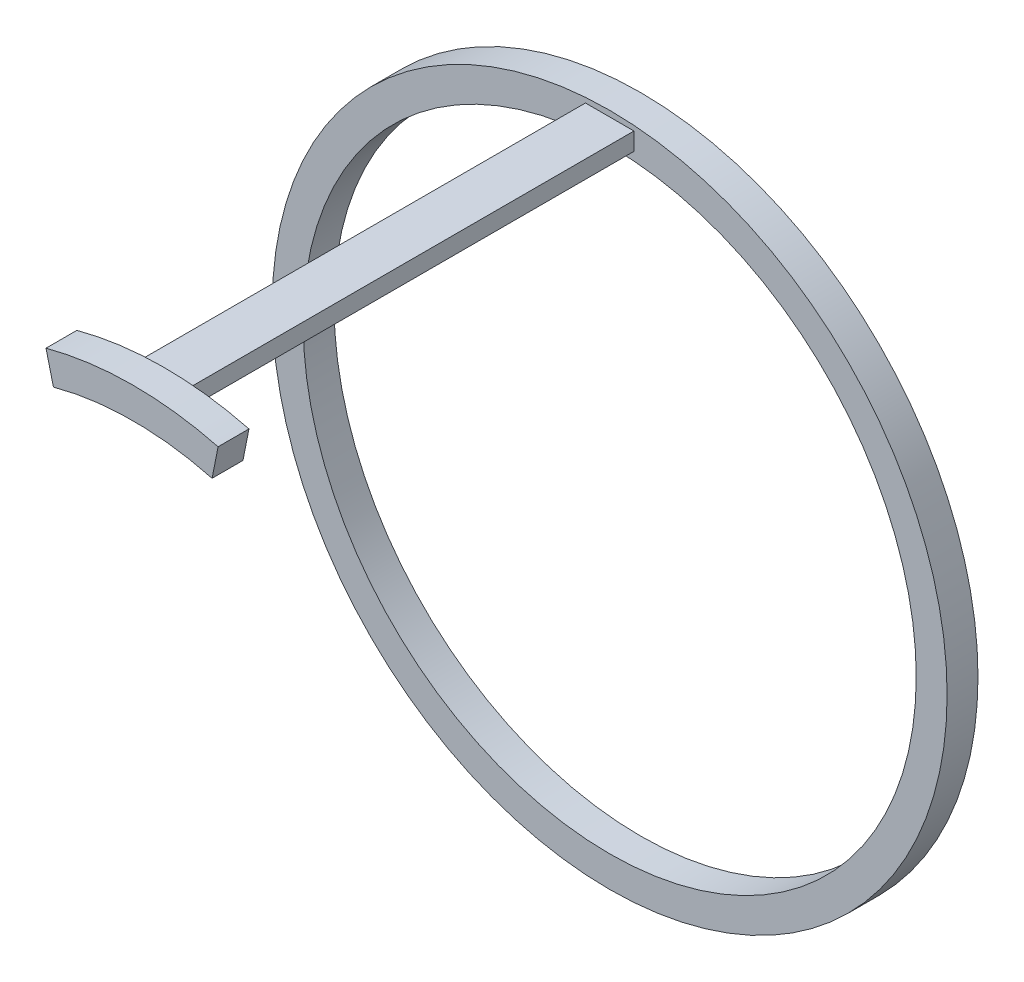
ISO-10303-21;
HEADER;
FILE_DESCRIPTION(('STEP AP214'),'2;1');
FILE_NAME('part.step','',(''),(''),'','','');
FILE_SCHEMA(('AUTOMOTIVE_DESIGN { 1 0 10303 214 1 1 1 1 }'));
ENDSEC;
DATA;
#1=APPLICATION_CONTEXT('core data for automotive mechanical design processes');
#2=APPLICATION_PROTOCOL_DEFINITION('international standard','automotive_design',2000,#1);
#3=PRODUCT_CONTEXT('',#1,'mechanical');
#4=PRODUCT('Part','Part','',(#3));
#5=PRODUCT_RELATED_PRODUCT_CATEGORY('part','',(#4));
#6=PRODUCT_DEFINITION_FORMATION('','',#4);
#7=PRODUCT_DEFINITION_CONTEXT('part definition',#1,'design');
#8=PRODUCT_DEFINITION('design','',#6,#7);
#9=PRODUCT_DEFINITION_SHAPE('','',#8);
#10=(LENGTH_UNIT() NAMED_UNIT(*) SI_UNIT(.MILLI.,.METRE.));
#11=(NAMED_UNIT(*) PLANE_ANGLE_UNIT() SI_UNIT($,.RADIAN.));
#12=(NAMED_UNIT(*) SI_UNIT($,.STERADIAN.) SOLID_ANGLE_UNIT());
#13=UNCERTAINTY_MEASURE_WITH_UNIT(LENGTH_MEASURE(1.E-05),#10,'distance_accuracy_value','');
#14=(GEOMETRIC_REPRESENTATION_CONTEXT(3) GLOBAL_UNCERTAINTY_ASSIGNED_CONTEXT((#13)) GLOBAL_UNIT_ASSIGNED_CONTEXT((#10,
#11,#12)) REPRESENTATION_CONTEXT('',''));
#15=CARTESIAN_POINT('',(0.,0.,0.));
#16=DIRECTION('',(0.,0.,1.));
#17=DIRECTION('',(1.,0.,0.));
#18=AXIS2_PLACEMENT_3D('',#15,#16,#17);
#19=CARTESIAN_POINT('',(0.,0.,7.));
#20=DIRECTION('',(0.,0.,1.));
#21=DIRECTION('',(1.,0.,0.));
#22=AXIS2_PLACEMENT_3D('',#19,#20,#21);
#23=PLANE('',#22);
#24=CARTESIAN_POINT('',(0.,0.,7.));
#25=DIRECTION('',(0.,0.,1.));
#26=DIRECTION('',(1.,0.,0.));
#27=AXIS2_PLACEMENT_3D('',#24,#25,#26);
#28=CIRCLE('',#27,76.5);
#29=CARTESIAN_POINT('',(76.5,0.,7.));
#30=VERTEX_POINT('',#29);
#31=EDGE_CURVE('E11',#30,#30,#28,.T.);
#32=ORIENTED_EDGE('',*,*,#31,.T.);
#33=EDGE_LOOP('',(#32));
#34=FACE_BOUND('',#33,.T.);
#35=CARTESIAN_POINT('',(0.,0.,7.));
#36=DIRECTION('',(0.,0.,1.));
#37=DIRECTION('',(1.,0.,0.));
#38=AXIS2_PLACEMENT_3D('',#35,#36,#37);
#39=CIRCLE('',#38,69.5);
#40=CARTESIAN_POINT('',(69.5,0.,7.));
#41=VERTEX_POINT('',#40);
#42=EDGE_CURVE('E190',#41,#41,#39,.T.);
#43=ORIENTED_EDGE('',*,*,#42,.F.);
#44=EDGE_LOOP('',(#43));
#45=FACE_BOUND('',#44,.T.);
#46=DIRECTION('',(-1.,0.,0.));
#47=VECTOR('',#46,1.);
#48=CARTESIAN_POINT('',(-5.49916820568348,75.1847427269013,7.));
#49=LINE('',#48,#47);
#50=CARTESIAN_POINT('',(5.49916820568348,75.1847427269013,7.));
#51=VERTEX_POINT('',#50);
#52=CARTESIAN_POINT('',(-5.49916820568348,75.1847427269013,7.));
#53=VERTEX_POINT('',#52);
#54=EDGE_CURVE('E150',#51,#53,#49,.T.);
#55=ORIENTED_EDGE('',*,*,#54,.F.);
#56=DIRECTION('',(0.,1.,0.));
#57=VECTOR('',#56,1.);
#58=CARTESIAN_POINT('',(5.49916820568348,75.1847427269013,7.));
#59=LINE('',#58,#57);
#60=CARTESIAN_POINT('',(5.49916820568348,71.1884632207251,7.));
#61=VERTEX_POINT('',#60);
#62=EDGE_CURVE('E145',#61,#51,#59,.T.);
#63=ORIENTED_EDGE('',*,*,#62,.F.);
#64=DIRECTION('',(1.,0.,0.));
#65=VECTOR('',#64,1.);
#66=CARTESIAN_POINT('',(-5.49916820568348,71.1884632207251,7.));
#67=LINE('',#66,#65);
#68=CARTESIAN_POINT('',(-5.49916820568348,71.1884632207251,7.));
#69=VERTEX_POINT('',#68);
#70=EDGE_CURVE('E81',#69,#61,#67,.T.);
#71=ORIENTED_EDGE('',*,*,#70,.F.);
#72=DIRECTION('',(0.,-1.,0.));
#73=VECTOR('',#72,1.);
#74=CARTESIAN_POINT('',(-5.49916820568348,75.1847427269013,7.));
#75=LINE('',#74,#73);
#76=EDGE_CURVE('E173',#53,#69,#75,.T.);
#77=ORIENTED_EDGE('',*,*,#76,.F.);
#78=EDGE_LOOP('',(#55,#63,#71,#77));
#79=FACE_BOUND('',#78,.T.);
#80=ADVANCED_FACE('F45',(#34,#45,#79),#23,.T.);
#81=CARTESIAN_POINT('',(0.,0.,0.));
#82=DIRECTION('',(0.,0.,1.));
#83=DIRECTION('',(1.,0.,0.));
#84=AXIS2_PLACEMENT_3D('',#81,#82,#83);
#85=PLANE('',#84);
#86=CARTESIAN_POINT('',(0.,0.,0.));
#87=DIRECTION('',(0.,0.,1.));
#88=DIRECTION('',(1.,0.,0.));
#89=AXIS2_PLACEMENT_3D('',#86,#87,#88);
#90=CIRCLE('',#89,76.5);
#91=CARTESIAN_POINT('',(76.5,0.,0.));
#92=VERTEX_POINT('',#91);
#93=EDGE_CURVE('E49',#92,#92,#90,.T.);
#94=ORIENTED_EDGE('',*,*,#93,.F.);
#95=EDGE_LOOP('',(#94));
#96=FACE_BOUND('',#95,.T.);
#97=CARTESIAN_POINT('',(0.,0.,0.));
#98=DIRECTION('',(0.,0.,1.));
#99=DIRECTION('',(1.,0.,0.));
#100=AXIS2_PLACEMENT_3D('',#97,#98,#99);
#101=CIRCLE('',#100,69.5);
#102=CARTESIAN_POINT('',(69.5,0.,0.));
#103=VERTEX_POINT('',#102);
#104=EDGE_CURVE('E189',#103,#103,#101,.T.);
#105=ORIENTED_EDGE('',*,*,#104,.T.);
#106=EDGE_LOOP('',(#105));
#107=FACE_BOUND('',#106,.T.);
#108=ADVANCED_FACE('F198',(#96,#107),#85,.F.);
#109=CARTESIAN_POINT('',(0.,0.,7.));
#110=DIRECTION('',(0.,0.,-1.));
#111=DIRECTION('',(-1.,0.,0.));
#112=AXIS2_PLACEMENT_3D('',#109,#110,#111);
#113=CYLINDRICAL_SURFACE('',#112,76.5);
#114=ORIENTED_EDGE('',*,*,#31,.F.);
#115=EDGE_LOOP('',(#114));
#116=FACE_BOUND('',#115,.T.);
#117=ORIENTED_EDGE('',*,*,#93,.T.);
#118=EDGE_LOOP('',(#117));
#119=FACE_BOUND('',#118,.T.);
#120=ADVANCED_FACE('F47',(#116,#119),#113,.T.);
#121=CARTESIAN_POINT('',(0.,0.,7.));
#122=DIRECTION('',(0.,0.,-1.));
#123=DIRECTION('',(-1.,0.,0.));
#124=AXIS2_PLACEMENT_3D('',#121,#122,#123);
#125=CYLINDRICAL_SURFACE('',#124,69.5);
#126=ORIENTED_EDGE('',*,*,#42,.T.);
#127=EDGE_LOOP('',(#126));
#128=FACE_BOUND('',#127,.T.);
#129=ORIENTED_EDGE('',*,*,#104,.F.);
#130=EDGE_LOOP('',(#129));
#131=FACE_BOUND('',#130,.T.);
#132=ADVANCED_FACE('F200',(#128,#131),#125,.F.);
#133=CARTESIAN_POINT('',(5.49916820568348,75.1847427269013,108.));
#134=DIRECTION('',(-1.,0.,0.));
#135=DIRECTION('',(0.,0.,1.));
#136=AXIS2_PLACEMENT_3D('',#133,#134,#135);
#137=PLANE('',#136);
#138=ORIENTED_EDGE('',*,*,#62,.T.);
#139=DIRECTION('',(0.,0.,-1.));
#140=VECTOR('',#139,1.);
#141=CARTESIAN_POINT('',(5.49916820568348,75.1847427269013,108.));
#142=LINE('',#141,#140);
#143=CARTESIAN_POINT('',(5.49916820568348,75.1847427269013,108.));
#144=VERTEX_POINT('',#143);
#145=EDGE_CURVE('E186',#144,#51,#142,.T.);
#146=ORIENTED_EDGE('',*,*,#145,.F.);
#147=DIRECTION('',(0.,1.,0.));
#148=VECTOR('',#147,1.);
#149=CARTESIAN_POINT('',(5.49916820568348,75.1847427269013,108.));
#150=LINE('',#149,#148);
#151=CARTESIAN_POINT('',(5.49916820568348,71.1884632207251,108.));
#152=VERTEX_POINT('',#151);
#153=EDGE_CURVE('E156',#152,#144,#150,.T.);
#154=ORIENTED_EDGE('',*,*,#153,.F.);
#155=DIRECTION('',(0.,0.,-1.));
#156=VECTOR('',#155,1.);
#157=CARTESIAN_POINT('',(5.49916820568348,71.1884632207251,108.));
#158=LINE('',#157,#156);
#159=EDGE_CURVE('E169',#152,#61,#158,.T.);
#160=ORIENTED_EDGE('',*,*,#159,.T.);
#161=EDGE_LOOP('',(#138,#146,#154,#160));
#162=FACE_BOUND('',#161,.T.);
#163=ADVANCED_FACE('F202',(#162),#137,.F.);
#164=CARTESIAN_POINT('',(-5.49916820568348,75.1847427269013,108.));
#165=DIRECTION('',(0.,-1.,0.));
#166=DIRECTION('',(0.,0.,-1.));
#167=AXIS2_PLACEMENT_3D('',#164,#165,#166);
#168=PLANE('',#167);
#169=ORIENTED_EDGE('',*,*,#54,.T.);
#170=DIRECTION('',(0.,0.,-1.));
#171=VECTOR('',#170,1.);
#172=CARTESIAN_POINT('',(-5.49916820568348,75.1847427269013,108.));
#173=LINE('',#172,#171);
#174=CARTESIAN_POINT('',(-5.49916820568348,75.1847427269013,108.));
#175=VERTEX_POINT('',#174);
#176=EDGE_CURVE('E182',#175,#53,#173,.T.);
#177=ORIENTED_EDGE('',*,*,#176,.F.);
#178=DIRECTION('',(-1.,0.,0.));
#179=VECTOR('',#178,1.);
#180=CARTESIAN_POINT('',(-5.49916820568348,75.1847427269013,108.));
#181=LINE('',#180,#179);
#182=EDGE_CURVE('E86',#144,#175,#181,.T.);
#183=ORIENTED_EDGE('',*,*,#182,.F.);
#184=ORIENTED_EDGE('',*,*,#145,.T.);
#185=EDGE_LOOP('',(#169,#177,#183,#184));
#186=FACE_BOUND('',#185,.T.);
#187=ADVANCED_FACE('F210',(#186),#168,.F.);
#188=CARTESIAN_POINT('',(-5.49916820568348,75.1847427269013,108.));
#189=DIRECTION('',(1.,0.,0.));
#190=DIRECTION('',(0.,0.,-1.));
#191=AXIS2_PLACEMENT_3D('',#188,#189,#190);
#192=PLANE('',#191);
#193=ORIENTED_EDGE('',*,*,#76,.T.);
#194=DIRECTION('',(0.,0.,-1.));
#195=VECTOR('',#194,1.);
#196=CARTESIAN_POINT('',(-5.49916820568348,71.1884632207251,108.));
#197=LINE('',#196,#195);
#198=CARTESIAN_POINT('',(-5.49916820568348,71.1884632207251,108.));
#199=VERTEX_POINT('',#198);
#200=EDGE_CURVE('E61',#199,#69,#197,.T.);
#201=ORIENTED_EDGE('',*,*,#200,.F.);
#202=DIRECTION('',(0.,-1.,0.));
#203=VECTOR('',#202,1.);
#204=CARTESIAN_POINT('',(-5.49916820568348,75.1847427269013,108.));
#205=LINE('',#204,#203);
#206=EDGE_CURVE('E162',#175,#199,#205,.T.);
#207=ORIENTED_EDGE('',*,*,#206,.F.);
#208=ORIENTED_EDGE('',*,*,#176,.T.);
#209=EDGE_LOOP('',(#193,#201,#207,#208));
#210=FACE_BOUND('',#209,.T.);
#211=ADVANCED_FACE('F227',(#210),#192,.F.);
#212=CARTESIAN_POINT('',(-5.49916820568348,71.1884632207251,108.));
#213=DIRECTION('',(0.,1.,0.));
#214=DIRECTION('',(0.,0.,1.));
#215=AXIS2_PLACEMENT_3D('',#212,#213,#214);
#216=PLANE('',#215);
#217=ORIENTED_EDGE('',*,*,#70,.T.);
#218=ORIENTED_EDGE('',*,*,#159,.F.);
#219=DIRECTION('',(1.,0.,0.));
#220=VECTOR('',#219,1.);
#221=CARTESIAN_POINT('',(-5.49916820568348,71.1884632207251,108.));
#222=LINE('',#221,#220);
#223=EDGE_CURVE('E166',#199,#152,#222,.T.);
#224=ORIENTED_EDGE('',*,*,#223,.F.);
#225=ORIENTED_EDGE('',*,*,#200,.T.);
#226=EDGE_LOOP('',(#217,#218,#224,#225));
#227=FACE_BOUND('',#226,.T.);
#228=ADVANCED_FACE('F231',(#227),#216,.F.);
#229=CARTESIAN_POINT('',(0.,0.,115.));
#230=DIRECTION('',(0.,0.,-1.));
#231=DIRECTION('',(-1.,0.,0.));
#232=AXIS2_PLACEMENT_3D('',#229,#230,#231);
#233=CYLINDRICAL_SURFACE('',#232,69.5);
#234=CARTESIAN_POINT('',(0.,0.,108.));
#235=DIRECTION('',(0.,0.,-1.));
#236=DIRECTION('',(-1.,0.,0.));
#237=AXIS2_PLACEMENT_3D('',#234,#235,#236);
#238=CIRCLE('',#237,69.5);
#239=CARTESIAN_POINT('',(-18.1199397658055,67.0963321119984,108.));
#240=VERTEX_POINT('',#239);
#241=CARTESIAN_POINT('',(17.8508325129362,67.168428436246,108.));
#242=VERTEX_POINT('',#241);
#243=EDGE_CURVE('E143',#240,#242,#238,.T.);
#244=ORIENTED_EDGE('',*,*,#243,.T.);
#245=DIRECTION('',(0.,0.,-1.));
#246=VECTOR('',#245,1.);
#247=CARTESIAN_POINT('',(17.8508325129362,67.168428436246,115.));
#248=LINE('',#247,#246);
#249=CARTESIAN_POINT('',(17.8508325129362,67.168428436246,115.));
#250=VERTEX_POINT('',#249);
#251=EDGE_CURVE('E121',#250,#242,#248,.T.);
#252=ORIENTED_EDGE('',*,*,#251,.F.);
#253=CARTESIAN_POINT('',(0.,0.,115.));
#254=DIRECTION('',(0.,0.,-1.));
#255=DIRECTION('',(-1.,0.,0.));
#256=AXIS2_PLACEMENT_3D('',#253,#254,#255);
#257=CIRCLE('',#256,69.5);
#258=CARTESIAN_POINT('',(-18.1199397658055,67.0963321119984,115.));
#259=VERTEX_POINT('',#258);
#260=EDGE_CURVE('E129',#259,#250,#257,.T.);
#261=ORIENTED_EDGE('',*,*,#260,.F.);
#262=DIRECTION('',(0.,0.,-1.));
#263=VECTOR('',#262,1.);
#264=CARTESIAN_POINT('',(-18.1199397658055,67.0963321119984,115.));
#265=LINE('',#264,#263);
#266=EDGE_CURVE('E311',#259,#240,#265,.T.);
#267=ORIENTED_EDGE('',*,*,#266,.T.);
#268=EDGE_LOOP('',(#244,#252,#261,#267));
#269=FACE_BOUND('',#268,.T.);
#270=ADVANCED_FACE('F141',(#269),#233,.F.);
#271=CARTESIAN_POINT('',(17.8508325129362,67.168428436246,115.));
#272=DIRECTION('',(-0.980867233973867,0.194677860365415,0.));
#273=DIRECTION('',(-0.194677860365415,-0.980867233973867,0.));
#274=AXIS2_PLACEMENT_3D('',#271,#272,#273);
#275=PLANE('',#274);
#276=DIRECTION('',(0.194677860365415,0.980867233973867,0.));
#277=VECTOR('',#276,1.);
#278=CARTESIAN_POINT('',(17.8508325129362,67.168428436246,108.));
#279=LINE('',#278,#277);
#280=CARTESIAN_POINT('',(19.2161031167581,74.0472239925719,108.));
#281=VERTEX_POINT('',#280);
#282=EDGE_CURVE('E319',#242,#281,#279,.T.);
#283=ORIENTED_EDGE('',*,*,#282,.T.);
#284=DIRECTION('',(0.,0.,-1.));
#285=VECTOR('',#284,1.);
#286=CARTESIAN_POINT('',(19.2161031167581,74.0472239925719,115.));
#287=LINE('',#286,#285);
#288=CARTESIAN_POINT('',(19.2161031167581,74.0472239925719,115.));
#289=VERTEX_POINT('',#288);
#290=EDGE_CURVE('E124',#289,#281,#287,.T.);
#291=ORIENTED_EDGE('',*,*,#290,.F.);
#292=DIRECTION('',(0.194677860365415,0.980867233973867,0.));
#293=VECTOR('',#292,1.);
#294=CARTESIAN_POINT('',(17.8508325129362,67.168428436246,115.));
#295=LINE('',#294,#293);
#296=EDGE_CURVE('E117',#250,#289,#295,.T.);
#297=ORIENTED_EDGE('',*,*,#296,.F.);
#298=ORIENTED_EDGE('',*,*,#251,.T.);
#299=EDGE_LOOP('',(#283,#291,#297,#298));
#300=FACE_BOUND('',#299,.T.);
#301=ADVANCED_FACE('F119',(#300),#275,.F.);
#302=CARTESIAN_POINT('',(0.,0.,115.));
#303=DIRECTION('',(0.,0.,-1.));
#304=DIRECTION('',(-1.,0.,0.));
#305=AXIS2_PLACEMENT_3D('',#302,#303,#304);
#306=CYLINDRICAL_SURFACE('',#305,76.5);
#307=CARTESIAN_POINT('',(0.,0.,108.));
#308=DIRECTION('',(0.,0.,1.));
#309=DIRECTION('',(-1.,0.,0.));
#310=AXIS2_PLACEMENT_3D('',#307,#308,#309);
#311=CIRCLE('',#310,76.5);
#312=CARTESIAN_POINT('',(-19.8014445936923,73.8928466903457,108.));
#313=VERTEX_POINT('',#312);
#314=EDGE_CURVE('E315',#281,#313,#311,.T.);
#315=ORIENTED_EDGE('',*,*,#314,.T.);
#316=DIRECTION('',(0.,0.,-1.));
#317=VECTOR('',#316,1.);
#318=CARTESIAN_POINT('',(-19.8014445936923,73.8928466903457,115.));
#319=LINE('',#318,#317);
#320=CARTESIAN_POINT('',(-19.8014445936923,73.8928466903457,115.));
#321=VERTEX_POINT('',#320);
#322=EDGE_CURVE('E152',#321,#313,#319,.T.);
#323=ORIENTED_EDGE('',*,*,#322,.F.);
#324=CARTESIAN_POINT('',(0.,0.,115.));
#325=DIRECTION('',(0.,0.,1.));
#326=DIRECTION('',(-1.,0.,0.));
#327=AXIS2_PLACEMENT_3D('',#324,#325,#326);
#328=CIRCLE('',#327,76.5);
#329=EDGE_CURVE('E128',#289,#321,#328,.T.);
#330=ORIENTED_EDGE('',*,*,#329,.F.);
#331=ORIENTED_EDGE('',*,*,#290,.T.);
#332=EDGE_LOOP('',(#315,#323,#330,#331));
#333=FACE_BOUND('',#332,.T.);
#334=ADVANCED_FACE('F272',(#333),#306,.T.);
#335=CARTESIAN_POINT('',(-18.1199397658055,67.0963321119984,115.));
#336=DIRECTION('',(0.970731883369603,0.240165798168064,0.));
#337=DIRECTION('',(-0.240165798168064,0.970731883369603,0.));
#338=AXIS2_PLACEMENT_3D('',#335,#336,#337);
#339=PLANE('',#338);
#340=DIRECTION('',(0.240165798168064,-0.970731883369603,0.));
#341=VECTOR('',#340,1.);
#342=CARTESIAN_POINT('',(-18.1199397658055,67.0963321119984,108.));
#343=LINE('',#342,#341);
#344=EDGE_CURVE('E139',#313,#240,#343,.T.);
#345=ORIENTED_EDGE('',*,*,#344,.T.);
#346=ORIENTED_EDGE('',*,*,#266,.F.);
#347=DIRECTION('',(0.240165798168064,-0.970731883369603,0.));
#348=VECTOR('',#347,1.);
#349=CARTESIAN_POINT('',(-18.1199397658055,67.0963321119984,115.));
#350=LINE('',#349,#348);
#351=EDGE_CURVE('E134',#321,#259,#350,.T.);
#352=ORIENTED_EDGE('',*,*,#351,.F.);
#353=ORIENTED_EDGE('',*,*,#322,.T.);
#354=EDGE_LOOP('',(#345,#346,#352,#353));
#355=FACE_BOUND('',#354,.T.);
#356=ADVANCED_FACE('F280',(#355),#339,.F.);
#357=CARTESIAN_POINT('',(0.,0.,115.));
#358=DIRECTION('',(0.,0.,-1.));
#359=DIRECTION('',(-1.,0.,0.));
#360=AXIS2_PLACEMENT_3D('',#357,#358,#359);
#361=PLANE('',#360);
#362=ORIENTED_EDGE('',*,*,#260,.T.);
#363=ORIENTED_EDGE('',*,*,#296,.T.);
#364=ORIENTED_EDGE('',*,*,#329,.T.);
#365=ORIENTED_EDGE('',*,*,#351,.T.);
#366=EDGE_LOOP('',(#362,#363,#364,#365));
#367=FACE_BOUND('',#366,.T.);
#368=ADVANCED_FACE('F132',(#367),#361,.F.);
#369=CARTESIAN_POINT('',(0.,0.,108.));
#370=DIRECTION('',(0.,0.,-1.));
#371=DIRECTION('',(-1.,0.,0.));
#372=AXIS2_PLACEMENT_3D('',#369,#370,#371);
#373=PLANE('',#372);
#374=ORIENTED_EDGE('',*,*,#223,.T.);
#375=ORIENTED_EDGE('',*,*,#153,.T.);
#376=ORIENTED_EDGE('',*,*,#182,.T.);
#377=ORIENTED_EDGE('',*,*,#206,.T.);
#378=EDGE_LOOP('',(#374,#375,#376,#377));
#379=FACE_BOUND('',#378,.T.);
#380=ORIENTED_EDGE('',*,*,#243,.F.);
#381=ORIENTED_EDGE('',*,*,#344,.F.);
#382=ORIENTED_EDGE('',*,*,#314,.F.);
#383=ORIENTED_EDGE('',*,*,#282,.F.);
#384=EDGE_LOOP('',(#380,#381,#382,#383));
#385=FACE_BOUND('',#384,.T.);
#386=ADVANCED_FACE('F229',(#379,#385),#373,.T.);
#387=CLOSED_SHELL('',(#80,#108,#120,#132,#163,#187,#211,#228,#270,#301,#334,#356,#368,#386));
#388=MANIFOLD_SOLID_BREP('B2',#387);
#389=ADVANCED_BREP_SHAPE_REPRESENTATION('',(#18,#388),#14);
#390=SHAPE_DEFINITION_REPRESENTATION(#9,#389);
ENDSEC;
END-ISO-10303-21;
